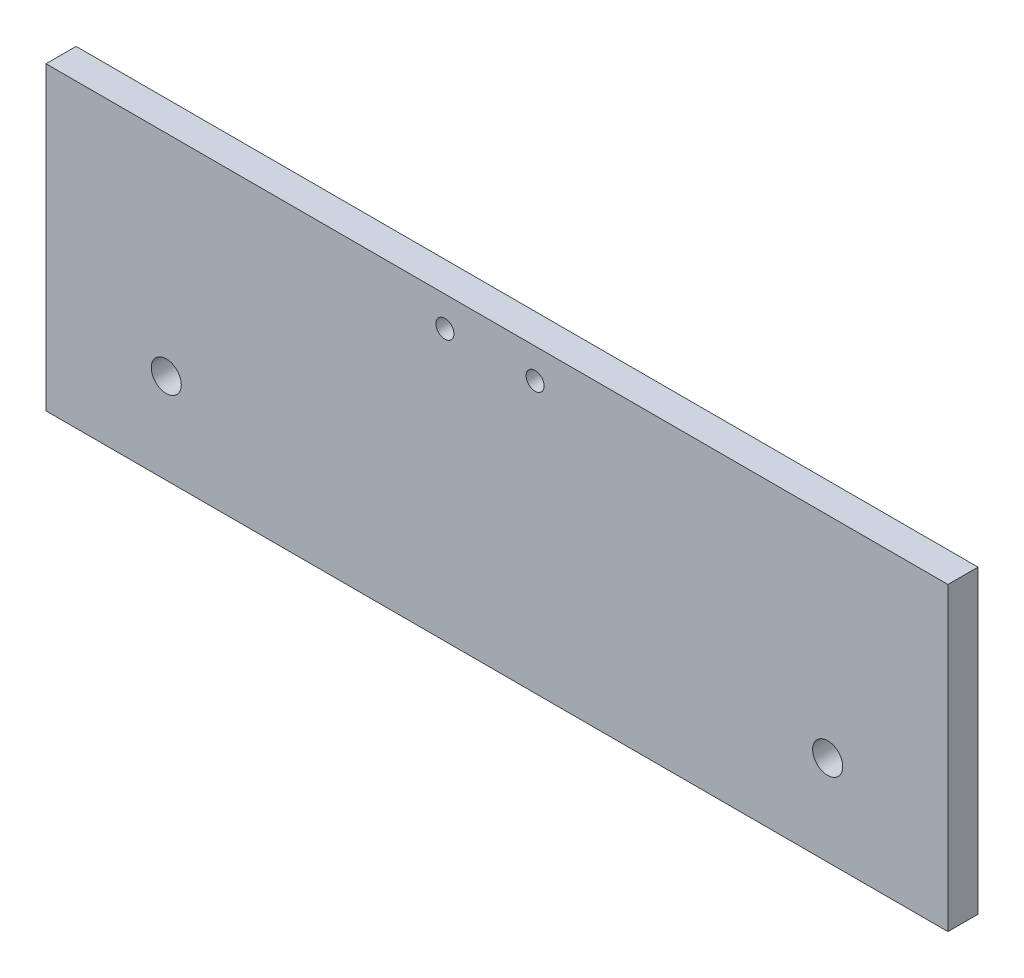
ISO-10303-21;
HEADER;
FILE_DESCRIPTION(('STEP AP214'),'2;1');
FILE_NAME('part.step','',(''),(''),'','','');
FILE_SCHEMA(('AUTOMOTIVE_DESIGN { 1 0 10303 214 1 1 1 1 }'));
ENDSEC;
DATA;
#1=APPLICATION_CONTEXT('core data for automotive mechanical design processes');
#2=APPLICATION_PROTOCOL_DEFINITION('international standard','automotive_design',2000,#1);
#3=PRODUCT_CONTEXT('',#1,'mechanical');
#4=PRODUCT('Part','Part','',(#3));
#5=PRODUCT_RELATED_PRODUCT_CATEGORY('part','',(#4));
#6=PRODUCT_DEFINITION_FORMATION('','',#4);
#7=PRODUCT_DEFINITION_CONTEXT('part definition',#1,'design');
#8=PRODUCT_DEFINITION('design','',#6,#7);
#9=PRODUCT_DEFINITION_SHAPE('','',#8);
#10=(LENGTH_UNIT() NAMED_UNIT(*) SI_UNIT(.MILLI.,.METRE.));
#11=(NAMED_UNIT(*) PLANE_ANGLE_UNIT() SI_UNIT($,.RADIAN.));
#12=(NAMED_UNIT(*) SI_UNIT($,.STERADIAN.) SOLID_ANGLE_UNIT());
#13=UNCERTAINTY_MEASURE_WITH_UNIT(LENGTH_MEASURE(1.E-05),#10,'distance_accuracy_value','');
#14=(GEOMETRIC_REPRESENTATION_CONTEXT(3) GLOBAL_UNCERTAINTY_ASSIGNED_CONTEXT((#13)) GLOBAL_UNIT_ASSIGNED_CONTEXT((#10,
#11,#12)) REPRESENTATION_CONTEXT('',''));
#15=CARTESIAN_POINT('',(0.,0.,0.));
#16=DIRECTION('',(0.,0.,1.));
#17=DIRECTION('',(1.,0.,0.));
#18=AXIS2_PLACEMENT_3D('',#15,#16,#17);
#19=CARTESIAN_POINT('',(-113.461768100943,100.,10.));
#20=DIRECTION('',(1.,0.,0.));
#21=DIRECTION('',(0.,0.,-1.));
#22=AXIS2_PLACEMENT_3D('',#19,#20,#21);
#23=PLANE('',#22);
#24=DIRECTION('',(0.,-1.,0.));
#25=VECTOR('',#24,1.);
#26=CARTESIAN_POINT('',(-113.461768100943,100.,0.));
#27=LINE('',#26,#25);
#28=CARTESIAN_POINT('',(-113.461768100943,100.,0.));
#29=VERTEX_POINT('',#28);
#30=CARTESIAN_POINT('',(-113.461768100943,0.,0.));
#31=VERTEX_POINT('',#30);
#32=EDGE_CURVE('E96',#29,#31,#27,.T.);
#33=ORIENTED_EDGE('',*,*,#32,.T.);
#34=DIRECTION('',(0.,0.,-1.));
#35=VECTOR('',#34,1.);
#36=CARTESIAN_POINT('',(-113.461768100943,0.,10.));
#37=LINE('',#36,#35);
#38=CARTESIAN_POINT('',(-113.461768100943,0.,10.));
#39=VERTEX_POINT('',#38);
#40=EDGE_CURVE('E11',#39,#31,#37,.T.);
#41=ORIENTED_EDGE('',*,*,#40,.F.);
#42=DIRECTION('',(0.,-1.,0.));
#43=VECTOR('',#42,1.);
#44=CARTESIAN_POINT('',(-113.461768100943,100.,10.));
#45=LINE('',#44,#43);
#46=CARTESIAN_POINT('',(-113.461768100943,100.,10.));
#47=VERTEX_POINT('',#46);
#48=EDGE_CURVE('E84',#47,#39,#45,.T.);
#49=ORIENTED_EDGE('',*,*,#48,.F.);
#50=DIRECTION('',(0.,0.,-1.));
#51=VECTOR('',#50,1.);
#52=CARTESIAN_POINT('',(-113.461768100943,100.,10.));
#53=LINE('',#52,#51);
#54=EDGE_CURVE('E92',#47,#29,#53,.T.);
#55=ORIENTED_EDGE('',*,*,#54,.T.);
#56=EDGE_LOOP('',(#33,#41,#49,#55));
#57=FACE_BOUND('',#56,.T.);
#58=ADVANCED_FACE('F33',(#57),#23,.F.);
#59=CARTESIAN_POINT('',(-113.461768100943,0.,10.));
#60=DIRECTION('',(0.,1.,0.));
#61=DIRECTION('',(0.,0.,1.));
#62=AXIS2_PLACEMENT_3D('',#59,#60,#61);
#63=PLANE('',#62);
#64=DIRECTION('',(1.,0.,0.));
#65=VECTOR('',#64,1.);
#66=CARTESIAN_POINT('',(-113.461768100943,0.,0.));
#67=LINE('',#66,#65);
#68=CARTESIAN_POINT('',(186.538231899057,0.,0.));
#69=VERTEX_POINT('',#68);
#70=EDGE_CURVE('E88',#31,#69,#67,.T.);
#71=ORIENTED_EDGE('',*,*,#70,.T.);
#72=DIRECTION('',(0.,0.,-1.));
#73=VECTOR('',#72,1.);
#74=CARTESIAN_POINT('',(186.538231899057,0.,10.));
#75=LINE('',#74,#73);
#76=CARTESIAN_POINT('',(186.538231899057,0.,10.));
#77=VERTEX_POINT('',#76);
#78=EDGE_CURVE('E41',#77,#69,#75,.T.);
#79=ORIENTED_EDGE('',*,*,#78,.F.);
#80=DIRECTION('',(1.,0.,0.));
#81=VECTOR('',#80,1.);
#82=CARTESIAN_POINT('',(-113.461768100943,0.,10.));
#83=LINE('',#82,#81);
#84=EDGE_CURVE('E79',#39,#77,#83,.T.);
#85=ORIENTED_EDGE('',*,*,#84,.F.);
#86=ORIENTED_EDGE('',*,*,#40,.T.);
#87=EDGE_LOOP('',(#71,#79,#85,#86));
#88=FACE_BOUND('',#87,.T.);
#89=ADVANCED_FACE('F87',(#88),#63,.F.);
#90=CARTESIAN_POINT('',(186.538231899057,0.,10.));
#91=DIRECTION('',(-1.,0.,0.));
#92=DIRECTION('',(0.,0.,1.));
#93=AXIS2_PLACEMENT_3D('',#90,#91,#92);
#94=PLANE('',#93);
#95=DIRECTION('',(0.,1.,0.));
#96=VECTOR('',#95,1.);
#97=CARTESIAN_POINT('',(186.538231899057,0.,0.));
#98=LINE('',#97,#96);
#99=CARTESIAN_POINT('',(186.538231899057,100.,0.));
#100=VERTEX_POINT('',#99);
#101=EDGE_CURVE('E66',#69,#100,#98,.T.);
#102=ORIENTED_EDGE('',*,*,#101,.T.);
#103=DIRECTION('',(0.,0.,-1.));
#104=VECTOR('',#103,1.);
#105=CARTESIAN_POINT('',(186.538231899057,100.,10.));
#106=LINE('',#105,#104);
#107=CARTESIAN_POINT('',(186.538231899057,100.,10.));
#108=VERTEX_POINT('',#107);
#109=EDGE_CURVE('E89',#108,#100,#106,.T.);
#110=ORIENTED_EDGE('',*,*,#109,.F.);
#111=DIRECTION('',(0.,1.,0.));
#112=VECTOR('',#111,1.);
#113=CARTESIAN_POINT('',(186.538231899057,0.,10.));
#114=LINE('',#113,#112);
#115=EDGE_CURVE('E82',#77,#108,#114,.T.);
#116=ORIENTED_EDGE('',*,*,#115,.F.);
#117=ORIENTED_EDGE('',*,*,#78,.T.);
#118=EDGE_LOOP('',(#102,#110,#116,#117));
#119=FACE_BOUND('',#118,.T.);
#120=ADVANCED_FACE('F90',(#119),#94,.F.);
#121=CARTESIAN_POINT('',(186.538231899057,100.,10.));
#122=DIRECTION('',(0.,-1.,0.));
#123=DIRECTION('',(1.,0.,0.));
#124=AXIS2_PLACEMENT_3D('',#121,#122,#123);
#125=PLANE('',#124);
#126=DIRECTION('',(-1.,0.,0.));
#127=VECTOR('',#126,1.);
#128=CARTESIAN_POINT('',(186.538231899057,100.,0.));
#129=LINE('',#128,#127);
#130=EDGE_CURVE('E72',#100,#29,#129,.T.);
#131=ORIENTED_EDGE('',*,*,#130,.T.);
#132=ORIENTED_EDGE('',*,*,#54,.F.);
#133=DIRECTION('',(-1.,0.,0.));
#134=VECTOR('',#133,1.);
#135=CARTESIAN_POINT('',(186.538231899057,100.,10.));
#136=LINE('',#135,#134);
#137=EDGE_CURVE('E49',#108,#47,#136,.T.);
#138=ORIENTED_EDGE('',*,*,#137,.F.);
#139=ORIENTED_EDGE('',*,*,#109,.T.);
#140=EDGE_LOOP('',(#131,#132,#138,#139));
#141=FACE_BOUND('',#140,.T.);
#142=ADVANCED_FACE('F104',(#141),#125,.F.);
#143=CARTESIAN_POINT('',(0.,0.,10.));
#144=DIRECTION('',(0.,0.,1.));
#145=DIRECTION('',(1.,0.,0.));
#146=AXIS2_PLACEMENT_3D('',#143,#144,#145);
#147=PLANE('',#146);
#148=CARTESIAN_POINT('',(146.538231899057,30.,10.));
#149=DIRECTION('',(0.,0.,1.));
#150=DIRECTION('',(1.,0.,0.));
#151=AXIS2_PLACEMENT_3D('',#148,#149,#150);
#152=CIRCLE('',#151,5.00000000000002);
#153=CARTESIAN_POINT('',(151.538231899057,30.,10.));
#154=VERTEX_POINT('',#153);
#155=EDGE_CURVE('E128',#154,#154,#152,.T.);
#156=ORIENTED_EDGE('',*,*,#155,.F.);
#157=EDGE_LOOP('',(#156));
#158=FACE_BOUND('',#157,.T.);
#159=CARTESIAN_POINT('',(-73.4617681009434,30.,10.));
#160=DIRECTION('',(0.,0.,1.));
#161=DIRECTION('',(1.,0.,0.));
#162=AXIS2_PLACEMENT_3D('',#159,#160,#161);
#163=CIRCLE('',#162,5.00000000000001);
#164=CARTESIAN_POINT('',(-68.4617681009434,30.,10.));
#165=VERTEX_POINT('',#164);
#166=EDGE_CURVE('E122',#165,#165,#163,.T.);
#167=ORIENTED_EDGE('',*,*,#166,.F.);
#168=EDGE_LOOP('',(#167));
#169=FACE_BOUND('',#168,.T.);
#170=CARTESIAN_POINT('',(19.2241963295975,90.0000000000001,10.));
#171=DIRECTION('',(0.,0.,1.));
#172=DIRECTION('',(1.,0.,0.));
#173=AXIS2_PLACEMENT_3D('',#170,#171,#172);
#174=CIRCLE('',#173,3.);
#175=CARTESIAN_POINT('',(22.2241963295975,90.0000000000001,10.));
#176=VERTEX_POINT('',#175);
#177=EDGE_CURVE('E116',#176,#176,#174,.T.);
#178=ORIENTED_EDGE('',*,*,#177,.F.);
#179=EDGE_LOOP('',(#178));
#180=FACE_BOUND('',#179,.T.);
#181=CARTESIAN_POINT('',(49.2241963295975,90.0000000000001,10.));
#182=DIRECTION('',(0.,0.,1.));
#183=DIRECTION('',(1.,0.,0.));
#184=AXIS2_PLACEMENT_3D('',#181,#182,#183);
#185=CIRCLE('',#184,2.99999999999999);
#186=CARTESIAN_POINT('',(52.2241963295975,90.0000000000001,10.));
#187=VERTEX_POINT('',#186);
#188=EDGE_CURVE('E110',#187,#187,#185,.T.);
#189=ORIENTED_EDGE('',*,*,#188,.F.);
#190=EDGE_LOOP('',(#189));
#191=FACE_BOUND('',#190,.T.);
#192=ORIENTED_EDGE('',*,*,#48,.T.);
#193=ORIENTED_EDGE('',*,*,#84,.T.);
#194=ORIENTED_EDGE('',*,*,#115,.T.);
#195=ORIENTED_EDGE('',*,*,#137,.T.);
#196=EDGE_LOOP('',(#192,#193,#194,#195));
#197=FACE_BOUND('',#196,.T.);
#198=ADVANCED_FACE('F80',(#158,#169,#180,#191,#197),#147,.T.);
#199=CARTESIAN_POINT('',(0.,0.,0.));
#200=DIRECTION('',(0.,0.,1.));
#201=DIRECTION('',(1.,0.,0.));
#202=AXIS2_PLACEMENT_3D('',#199,#200,#201);
#203=PLANE('',#202);
#204=CARTESIAN_POINT('',(146.538231899057,30.,0.));
#205=DIRECTION('',(0.,0.,1.));
#206=DIRECTION('',(1.,0.,0.));
#207=AXIS2_PLACEMENT_3D('',#204,#205,#206);
#208=CIRCLE('',#207,5.00000000000002);
#209=CARTESIAN_POINT('',(151.538231899057,30.,0.));
#210=VERTEX_POINT('',#209);
#211=EDGE_CURVE('E125',#210,#210,#208,.T.);
#212=ORIENTED_EDGE('',*,*,#211,.T.);
#213=EDGE_LOOP('',(#212));
#214=FACE_BOUND('',#213,.T.);
#215=CARTESIAN_POINT('',(-73.4617681009434,30.,0.));
#216=DIRECTION('',(0.,0.,1.));
#217=DIRECTION('',(1.,0.,0.));
#218=AXIS2_PLACEMENT_3D('',#215,#216,#217);
#219=CIRCLE('',#218,5.00000000000001);
#220=CARTESIAN_POINT('',(-68.4617681009434,30.,0.));
#221=VERTEX_POINT('',#220);
#222=EDGE_CURVE('E119',#221,#221,#219,.T.);
#223=ORIENTED_EDGE('',*,*,#222,.T.);
#224=EDGE_LOOP('',(#223));
#225=FACE_BOUND('',#224,.T.);
#226=CARTESIAN_POINT('',(19.2241963295975,90.0000000000001,0.));
#227=DIRECTION('',(0.,0.,1.));
#228=DIRECTION('',(1.,0.,0.));
#229=AXIS2_PLACEMENT_3D('',#226,#227,#228);
#230=CIRCLE('',#229,3.);
#231=CARTESIAN_POINT('',(22.2241963295975,90.0000000000001,0.));
#232=VERTEX_POINT('',#231);
#233=EDGE_CURVE('E113',#232,#232,#230,.T.);
#234=ORIENTED_EDGE('',*,*,#233,.T.);
#235=EDGE_LOOP('',(#234));
#236=FACE_BOUND('',#235,.T.);
#237=CARTESIAN_POINT('',(49.2241963295975,90.0000000000001,0.));
#238=DIRECTION('',(0.,0.,1.));
#239=DIRECTION('',(1.,0.,0.));
#240=AXIS2_PLACEMENT_3D('',#237,#238,#239);
#241=CIRCLE('',#240,2.99999999999999);
#242=CARTESIAN_POINT('',(52.2241963295975,90.0000000000001,0.));
#243=VERTEX_POINT('',#242);
#244=EDGE_CURVE('E99',#243,#243,#241,.T.);
#245=ORIENTED_EDGE('',*,*,#244,.T.);
#246=EDGE_LOOP('',(#245));
#247=FACE_BOUND('',#246,.T.);
#248=ORIENTED_EDGE('',*,*,#32,.F.);
#249=ORIENTED_EDGE('',*,*,#130,.F.);
#250=ORIENTED_EDGE('',*,*,#101,.F.);
#251=ORIENTED_EDGE('',*,*,#70,.F.);
#252=EDGE_LOOP('',(#248,#249,#250,#251));
#253=FACE_BOUND('',#252,.T.);
#254=ADVANCED_FACE('F107',(#214,#225,#236,#247,#253),#203,.F.);
#255=CARTESIAN_POINT('',(49.2241963295975,90.0000000000001,0.));
#256=DIRECTION('',(0.,0.,1.));
#257=DIRECTION('',(1.,0.,0.));
#258=AXIS2_PLACEMENT_3D('',#255,#256,#257);
#259=CYLINDRICAL_SURFACE('',#258,2.99999999999999);
#260=ORIENTED_EDGE('',*,*,#244,.F.);
#261=EDGE_LOOP('',(#260));
#262=FACE_BOUND('',#261,.T.);
#263=ORIENTED_EDGE('',*,*,#188,.T.);
#264=EDGE_LOOP('',(#263));
#265=FACE_BOUND('',#264,.T.);
#266=ADVANCED_FACE('F152',(#262,#265),#259,.F.);
#267=CARTESIAN_POINT('',(19.2241963295975,90.0000000000001,0.));
#268=DIRECTION('',(0.,0.,1.));
#269=DIRECTION('',(1.,0.,0.));
#270=AXIS2_PLACEMENT_3D('',#267,#268,#269);
#271=CYLINDRICAL_SURFACE('',#270,3.);
#272=ORIENTED_EDGE('',*,*,#233,.F.);
#273=EDGE_LOOP('',(#272));
#274=FACE_BOUND('',#273,.T.);
#275=ORIENTED_EDGE('',*,*,#177,.T.);
#276=EDGE_LOOP('',(#275));
#277=FACE_BOUND('',#276,.T.);
#278=ADVANCED_FACE('F154',(#274,#277),#271,.F.);
#279=CARTESIAN_POINT('',(-73.4617681009434,30.,0.));
#280=DIRECTION('',(0.,0.,1.));
#281=DIRECTION('',(1.,0.,0.));
#282=AXIS2_PLACEMENT_3D('',#279,#280,#281);
#283=CYLINDRICAL_SURFACE('',#282,5.00000000000001);
#284=ORIENTED_EDGE('',*,*,#222,.F.);
#285=EDGE_LOOP('',(#284));
#286=FACE_BOUND('',#285,.T.);
#287=ORIENTED_EDGE('',*,*,#166,.T.);
#288=EDGE_LOOP('',(#287));
#289=FACE_BOUND('',#288,.T.);
#290=ADVANCED_FACE('F139',(#286,#289),#283,.F.);
#291=CARTESIAN_POINT('',(146.538231899057,30.,0.));
#292=DIRECTION('',(0.,0.,1.));
#293=DIRECTION('',(1.,0.,0.));
#294=AXIS2_PLACEMENT_3D('',#291,#292,#293);
#295=CYLINDRICAL_SURFACE('',#294,5.00000000000002);
#296=ORIENTED_EDGE('',*,*,#211,.F.);
#297=EDGE_LOOP('',(#296));
#298=FACE_BOUND('',#297,.T.);
#299=ORIENTED_EDGE('',*,*,#155,.T.);
#300=EDGE_LOOP('',(#299));
#301=FACE_BOUND('',#300,.T.);
#302=ADVANCED_FACE('F136',(#298,#301),#295,.F.);
#303=CLOSED_SHELL('',(#58,#89,#120,#142,#198,#254,#266,#278,#290,#302));
#304=MANIFOLD_SOLID_BREP('B2',#303);
#305=ADVANCED_BREP_SHAPE_REPRESENTATION('',(#18,#304),#14);
#306=SHAPE_DEFINITION_REPRESENTATION(#9,#305);
ENDSEC;
END-ISO-10303-21;
